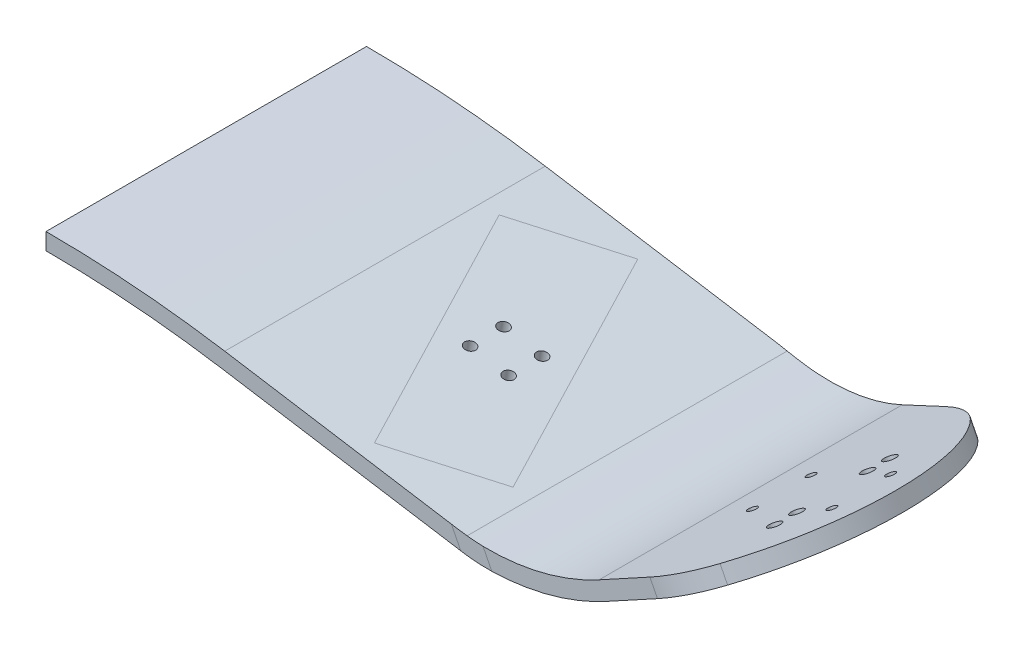
ISO-10303-21;
HEADER;
FILE_DESCRIPTION(('STEP AP214'),'2;1');
FILE_NAME('part.step','',(''),(''),'','','');
FILE_SCHEMA(('AUTOMOTIVE_DESIGN { 1 0 10303 214 1 1 1 1 }'));
ENDSEC;
DATA;
#1=APPLICATION_CONTEXT('core data for automotive mechanical design processes');
#2=APPLICATION_PROTOCOL_DEFINITION('international standard','automotive_design',2000,#1);
#3=PRODUCT_CONTEXT('',#1,'mechanical');
#4=PRODUCT('Part','Part','',(#3));
#5=PRODUCT_RELATED_PRODUCT_CATEGORY('part','',(#4));
#6=PRODUCT_DEFINITION_FORMATION('','',#4);
#7=PRODUCT_DEFINITION_CONTEXT('part definition',#1,'design');
#8=PRODUCT_DEFINITION('design','',#6,#7);
#9=PRODUCT_DEFINITION_SHAPE('','',#8);
#10=(LENGTH_UNIT() NAMED_UNIT(*) SI_UNIT(.MILLI.,.METRE.));
#11=(NAMED_UNIT(*) PLANE_ANGLE_UNIT() SI_UNIT($,.RADIAN.));
#12=(NAMED_UNIT(*) SI_UNIT($,.STERADIAN.) SOLID_ANGLE_UNIT());
#13=UNCERTAINTY_MEASURE_WITH_UNIT(LENGTH_MEASURE(1.E-05),#10,'distance_accuracy_value','');
#14=(GEOMETRIC_REPRESENTATION_CONTEXT(3) GLOBAL_UNCERTAINTY_ASSIGNED_CONTEXT((#13)) GLOBAL_UNIT_ASSIGNED_CONTEXT((#10,
#11,#12)) REPRESENTATION_CONTEXT('',''));
#15=CARTESIAN_POINT('',(0.,0.,0.));
#16=DIRECTION('',(0.,0.,1.));
#17=DIRECTION('',(1.,0.,0.));
#18=AXIS2_PLACEMENT_3D('',#15,#16,#17);
#19=CARTESIAN_POINT('',(500.,70.,115.));
#20=DIRECTION('',(0.453990499739547,-0.891006524188368,0.));
#21=DIRECTION('',(0.891006524188368,0.453990499739547,0.));
#22=AXIS2_PLACEMENT_3D('',#19,#20,#21);
#23=PLANE('',#22);
#24=CARTESIAN_POINT('',(425.570778440515,32.0764174293827,41.1730643960025));
#25=DIRECTION('',(0.453990499739547,-0.891006524188368,0.));
#26=DIRECTION('',(0.891006524188368,0.453990499739547,0.));
#27=AXIS2_PLACEMENT_3D('',#24,#25,#26);
#28=CIRCLE('',#27,65.);
#29=CARTESIAN_POINT('',(463.969896391473,51.6417452635345,89.8321405003692));
#30=VERTEX_POINT('',#29);
#31=CARTESIAN_POINT('',(429.794226452992,34.2283716763565,106.));
#32=VERTEX_POINT('',#31);
#33=EDGE_CURVE('E199',#30,#32,#28,.T.);
#34=ORIENTED_EDGE('',*,*,#33,.T.);
#35=DIRECTION('',(-0.888634193327707,-0.452781736791419,0.0729244079644266));
#36=VECTOR('',#35,1.);
#37=CARTESIAN_POINT('',(499.043419751203,69.5125980187544,100.317170708483));
#38=LINE('',#37,#36);
#39=CARTESIAN_POINT('',(396.134492808404,17.0778807612352,108.762234636819));
#40=VERTEX_POINT('',#39);
#41=EDGE_CURVE('E424',#32,#40,#38,.T.);
#42=ORIENTED_EDGE('',*,*,#41,.T.);
#43=DIRECTION('',(0.,0.,-1.));
#44=VECTOR('',#43,1.);
#45=CARTESIAN_POINT('',(396.134492808404,17.0778807612351,115.));
#46=LINE('',#45,#44);
#47=CARTESIAN_POINT('',(396.134492808404,17.0778807612352,-108.762234636819));
#48=VERTEX_POINT('',#47);
#49=EDGE_CURVE('E218',#40,#48,#46,.T.);
#50=ORIENTED_EDGE('',*,*,#49,.T.);
#51=DIRECTION('',(0.888634193327707,0.452781736791419,0.0729244079644266));
#52=VECTOR('',#51,1.);
#53=CARTESIAN_POINT('',(513.948137913638,77.1069312400568,-99.0940377747818));
#54=LINE('',#53,#52);
#55=CARTESIAN_POINT('',(429.794226452992,34.2283716763565,-106.));
#56=VERTEX_POINT('',#55);
#57=EDGE_CURVE('E414',#48,#56,#54,.T.);
#58=ORIENTED_EDGE('',*,*,#57,.T.);
#59=CARTESIAN_POINT('',(425.570778440515,32.0764174293827,-41.1730643960025));
#60=DIRECTION('',(0.453990499739547,-0.891006524188368,0.));
#61=DIRECTION('',(0.891006524188368,0.453990499739547,0.));
#62=AXIS2_PLACEMENT_3D('',#59,#60,#61);
#63=CIRCLE('',#62,65.);
#64=CARTESIAN_POINT('',(463.969896391473,51.6417452635345,-89.8321405003691));
#65=VERTEX_POINT('',#64);
#66=EDGE_CURVE('E430',#56,#65,#63,.T.);
#67=ORIENTED_EDGE('',*,*,#66,.T.);
#68=CARTESIAN_POINT('',(393.079217097396,15.5211400312543,0.));
#69=DIRECTION('',(0.453990499739547,-0.891006524188368,0.));
#70=DIRECTION('',(0.891006524188368,0.453990499739547,0.));
#71=AXIS2_PLACEMENT_3D('',#68,#69,#70);
#72=CIRCLE('',#71,120.);
#73=EDGE_CURVE('E432',#65,#30,#72,.T.);
#74=ORIENTED_EDGE('',*,*,#73,.T.);
#75=EDGE_LOOP('',(#34,#42,#50,#58,#67,#74));
#76=FACE_BOUND('',#75,.T.);
#77=CARTESIAN_POINT('',(475.434073461169,57.4830352380548,-21.));
#78=DIRECTION('',(0.453990499739547,-0.891006524188368,0.));
#79=DIRECTION('',(0.891006524188368,0.453990499739547,0.));
#80=AXIS2_PLACEMENT_3D('',#77,#78,#79);
#81=CIRCLE('',#80,3.29999999999999);
#82=CARTESIAN_POINT('',(478.37439499099,58.9812038871953,-21.));
#83=VERTEX_POINT('',#82);
#84=EDGE_CURVE('E337',#83,#83,#81,.T.);
#85=ORIENTED_EDGE('',*,*,#84,.F.);
#86=EDGE_LOOP('',(#85));
#87=FACE_BOUND('',#86,.T.);
#88=CARTESIAN_POINT('',(475.434073461169,57.4830352380548,21.));
#89=DIRECTION('',(0.453990499739547,-0.891006524188368,0.));
#90=DIRECTION('',(0.891006524188368,0.453990499739547,0.));
#91=AXIS2_PLACEMENT_3D('',#88,#89,#90);
#92=CIRCLE('',#91,3.29999999999999);
#93=CARTESIAN_POINT('',(478.37439499099,58.9812038871953,21.));
#94=VERTEX_POINT('',#93);
#95=EDGE_CURVE('E808',#94,#94,#92,.T.);
#96=ORIENTED_EDGE('',*,*,#95,.F.);
#97=EDGE_LOOP('',(#96));
#98=FACE_BOUND('',#97,.T.);
#99=CARTESIAN_POINT('',(454.685204532394,46.9109584706199,-41.35));
#100=DIRECTION('',(0.453990499739547,-0.891006524188368,0.));
#101=DIRECTION('',(0.891006524188368,0.453990499739547,0.));
#102=AXIS2_PLACEMENT_3D('',#99,#100,#101);
#103=CIRCLE('',#102,4.49999999999999);
#104=CARTESIAN_POINT('',(458.694733891242,48.9539157194479,-41.35));
#105=VERTEX_POINT('',#104);
#106=EDGE_CURVE('E801',#105,#105,#103,.T.);
#107=ORIENTED_EDGE('',*,*,#106,.F.);
#108=EDGE_LOOP('',(#107));
#109=FACE_BOUND('',#108,.T.);
#110=CARTESIAN_POINT('',(454.685204532394,46.9109584706199,41.35));
#111=DIRECTION('',(0.453990499739547,-0.891006524188368,0.));
#112=DIRECTION('',(0.891006524188368,0.453990499739547,0.));
#113=AXIS2_PLACEMENT_3D('',#110,#111,#112);
#114=CIRCLE('',#113,4.49999999999999);
#115=CARTESIAN_POINT('',(458.694733891242,48.9539157194479,41.35));
#116=VERTEX_POINT('',#115);
#117=EDGE_CURVE('E786',#116,#116,#114,.T.);
#118=ORIENTED_EDGE('',*,*,#117,.F.);
#119=EDGE_LOOP('',(#118));
#120=FACE_BOUND('',#119,.T.);
#121=CARTESIAN_POINT('',(440.684819017822,39.7774057482125,0.));
#122=DIRECTION('',(0.453990499739547,-0.891006524188368,0.));
#123=DIRECTION('',(0.891006524188368,0.453990499739547,0.));
#124=AXIS2_PLACEMENT_3D('',#121,#122,#123);
#125=CIRCLE('',#124,37.5);
#126=CARTESIAN_POINT('',(474.097563674886,56.8020494884455,0.));
#127=VERTEX_POINT('',#126);
#128=EDGE_CURVE('E11',#127,#127,#125,.F.);
#129=ORIENTED_EDGE('',*,*,#128,.T.);
#130=EDGE_LOOP('',(#129));
#131=FACE_BOUND('',#130,.T.);
#132=ADVANCED_FACE('F41',(#76,#87,#98,#109,#120,#131),#23,.T.);
#133=CARTESIAN_POINT('',(302.042599511785,13.8329261866839,115.));
#134=DIRECTION('',(-0.158669205585093,-0.987331799953286,0.));
#135=DIRECTION('',(0.987331799953286,-0.158669205585093,0.));
#136=AXIS2_PLACEMENT_3D('',#133,#134,#135);
#137=PLANE('',#136);
#138=DIRECTION('',(0.,0.,-1.));
#139=VECTOR('',#138,1.);
#140=CARTESIAN_POINT('',(302.042599511785,13.8329261866839,115.));
#141=LINE('',#140,#139);
#142=CARTESIAN_POINT('',(302.042599511785,13.8329261866839,114.833314530342));
#143=VERTEX_POINT('',#142);
#144=CARTESIAN_POINT('',(302.042599511785,13.8329261866839,-114.833314530342));
#145=VERTEX_POINT('',#144);
#146=EDGE_CURVE('E212',#143,#145,#141,.T.);
#147=ORIENTED_EDGE('',*,*,#146,.T.);
#148=CARTESIAN_POINT('',(290.884693319234,15.6260580514214,135.));
#149=DIRECTION('',(-0.158669205585093,-0.987331799953286,0.));
#150=DIRECTION('',(0.987331799953286,-0.158669205585093,0.));
#151=AXIS2_PLACEMENT_3D('',#148,#149,#150);
#152=ELLIPSE('',#151,309.526700689435,250.);
#153=CARTESIAN_POINT('',(290.884693319234,15.6260580514215,-115.));
#154=VERTEX_POINT('',#153);
#155=EDGE_CURVE('E493',#145,#154,#152,.F.);
#156=ORIENTED_EDGE('',*,*,#155,.T.);
#157=DIRECTION('',(-0.987331799953286,0.158669205585093,0.));
#158=VECTOR('',#157,1.);
#159=CARTESIAN_POINT('',(302.042599511785,13.8329261866839,-115.));
#160=LINE('',#159,#158);
#161=CARTESIAN_POINT('',(128.272202720007,41.7587063696602,-115.));
#162=VERTEX_POINT('',#161);
#163=EDGE_CURVE('E196',#154,#162,#160,.T.);
#164=ORIENTED_EDGE('',*,*,#163,.T.);
#165=DIRECTION('',(0.,0.,-1.));
#166=VECTOR('',#165,1.);
#167=CARTESIAN_POINT('',(128.272202720007,41.7587063696602,115.));
#168=LINE('',#167,#166);
#169=CARTESIAN_POINT('',(128.272202720007,41.7587063696602,115.));
#170=VERTEX_POINT('',#169);
#171=EDGE_CURVE('E204',#170,#162,#168,.T.);
#172=ORIENTED_EDGE('',*,*,#171,.F.);
#173=DIRECTION('',(-0.987331799953286,0.158669205585093,0.));
#174=VECTOR('',#173,1.);
#175=CARTESIAN_POINT('',(302.042599511785,13.8329261866839,115.));
#176=LINE('',#175,#174);
#177=CARTESIAN_POINT('',(290.884693319234,15.6260580514215,115.));
#178=VERTEX_POINT('',#177);
#179=EDGE_CURVE('E193',#178,#170,#176,.T.);
#180=ORIENTED_EDGE('',*,*,#179,.F.);
#181=CARTESIAN_POINT('',(290.884693319234,15.6260580514214,-135.));
#182=DIRECTION('',(-0.158669205585093,-0.987331799953286,0.));
#183=DIRECTION('',(-0.987331799953286,0.158669205585093,0.));
#184=AXIS2_PLACEMENT_3D('',#181,#182,#183);
#185=ELLIPSE('',#184,309.526700689435,250.);
#186=EDGE_CURVE('E282',#178,#143,#185,.F.);
#187=ORIENTED_EDGE('',*,*,#186,.T.);
#188=EDGE_LOOP('',(#147,#156,#164,#172,#180,#187));
#189=FACE_BOUND('',#188,.T.);
#190=DIRECTION('',(0.886961307594917,-0.142539160662565,-0.439297423742874));
#191=VECTOR('',#190,1.);
#192=CARTESIAN_POINT('',(282.242889237076,17.0148396024693,73.9910543309096));
#193=LINE('',#192,#191);
#194=CARTESIAN_POINT('',(223.672519842727,26.4273937033973,103.));
#195=VERTEX_POINT('',#194);
#196=CARTESIAN_POINT('',(290.194617912345,15.736956653705,70.0526932192845));
#197=VERTEX_POINT('',#196);
#198=EDGE_CURVE('E51',#195,#197,#193,.T.);
#199=ORIENTED_EDGE('',*,*,#198,.F.);
#200=DIRECTION('',(0.433732316098893,-0.0697029732408597,0.898341679703705));
#201=VECTOR('',#200,1.);
#202=CARTESIAN_POINT('',(243.472230117435,23.2454802876119,144.00894566909));
#203=LINE('',#202,#201);
#204=CARTESIAN_POINT('',(140.120184319446,39.8546759026391,-70.0526932192845));
#205=VERTEX_POINT('',#204);
#206=EDGE_CURVE('E350',#205,#195,#203,.T.);
#207=ORIENTED_EDGE('',*,*,#206,.F.);
#208=DIRECTION('',(-0.886961307594917,0.142539160662565,0.439297423742874));
#209=VECTOR('',#208,1.);
#210=CARTESIAN_POINT('',(198.690553713796,30.4421218017111,-99.0616388883749));
#211=LINE('',#210,#209);
#212=CARTESIAN_POINT('',(206.642282389065,29.1642388529467,-103.));
#213=VERTEX_POINT('',#212);
#214=EDGE_CURVE('E353',#213,#205,#211,.T.);
#215=ORIENTED_EDGE('',*,*,#214,.F.);
#216=DIRECTION('',(-0.433732316098893,0.0697029732408597,-0.898341679703705));
#217=VECTOR('',#216,1.);
#218=CARTESIAN_POINT('',(309.994328187054,12.5550432379195,111.061638888375));
#219=LINE('',#218,#217);
#220=EDGE_CURVE('E61',#197,#213,#219,.T.);
#221=ORIENTED_EDGE('',*,*,#220,.F.);
#222=EDGE_LOOP('',(#199,#207,#215,#221));
#223=FACE_BOUND('',#222,.T.);
#224=ADVANCED_FACE('F303',(#189,#223),#137,.F.);
#225=CARTESIAN_POINT('',(-325.,156.687183650789,115.));
#226=DIRECTION('',(0.,0.,-1.));
#227=DIRECTION('',(-1.,0.,0.));
#228=AXIS2_PLACEMENT_3D('',#225,#226,#227);
#229=PLANE('',#228);
#230=DIRECTION('',(0.,-1.,0.));
#231=VECTOR('',#230,1.);
#232=CARTESIAN_POINT('',(0.,80.6920782902604,115.));
#233=LINE('',#232,#231);
#234=CARTESIAN_POINT('',(0.,52.,115.));
#235=VERTEX_POINT('',#234);
#236=CARTESIAN_POINT('',(0.,40.,115.));
#237=VERTEX_POINT('',#236);
#238=EDGE_CURVE('E167',#235,#237,#233,.T.);
#239=ORIENTED_EDGE('',*,*,#238,.T.);
#240=CARTESIAN_POINT('',(0.,-756.42531634921,115.));
#241=DIRECTION('',(0.,0.,1.));
#242=DIRECTION('',(-1.,0.,0.));
#243=AXIS2_PLACEMENT_3D('',#240,#241,#242);
#244=CIRCLE('',#243,796.42531634921);
#245=CARTESIAN_POINT('',(126.368172252985,29.9107247702207,115.));
#246=VERTEX_POINT('',#245);
#247=EDGE_CURVE('E182',#246,#237,#244,.T.);
#248=ORIENTED_EDGE('',*,*,#247,.F.);
#249=DIRECTION('',(-0.987331799953286,0.158669205585093,0.));
#250=VECTOR('',#249,1.);
#251=CARTESIAN_POINT('',(300.138569044764,1.98494458724443,115.));
#252=LINE('',#251,#250);
#253=CARTESIAN_POINT('',(297.629758032613,2.38812318463176,115.));
#254=VERTEX_POINT('',#253);
#255=EDGE_CURVE('E190',#254,#246,#252,.T.);
#256=ORIENTED_EDGE('',*,*,#255,.F.);
#257=DIRECTION('',(0.453990499739547,-0.891006524188368,0.));
#258=VECTOR('',#257,1.);
#259=CARTESIAN_POINT('',(293.909757138151,9.68903602059101,115.));
#260=LINE('',#259,#258);
#261=EDGE_CURVE('E343',#254,#178,#260,.F.);
#262=ORIENTED_EDGE('',*,*,#261,.T.);
#263=ORIENTED_EDGE('',*,*,#179,.T.);
#264=CARTESIAN_POINT('',(0.,-756.42531634921,115.));
#265=DIRECTION('',(0.,0.,1.));
#266=DIRECTION('',(1.,0.,0.));
#267=AXIS2_PLACEMENT_3D('',#264,#265,#266);
#268=CIRCLE('',#267,808.42531634921);
#269=EDGE_CURVE('E184',#170,#235,#268,.T.);
#270=ORIENTED_EDGE('',*,*,#269,.T.);
#271=EDGE_LOOP('',(#239,#248,#256,#262,#263,#270));
#272=FACE_BOUND('',#271,.T.);
#273=ADVANCED_FACE('F180',(#272),#229,.F.);
#274=CARTESIAN_POINT('',(-325.,156.687183650789,-115.));
#275=DIRECTION('',(0.,0.,-1.));
#276=DIRECTION('',(-1.,0.,0.));
#277=AXIS2_PLACEMENT_3D('',#274,#275,#276);
#278=PLANE('',#277);
#279=CARTESIAN_POINT('',(0.,-756.42531634921,-115.));
#280=DIRECTION('',(0.,0.,1.));
#281=DIRECTION('',(-1.,0.,0.));
#282=AXIS2_PLACEMENT_3D('',#279,#280,#281);
#283=CIRCLE('',#282,796.42531634921);
#284=CARTESIAN_POINT('',(126.368172252985,29.9107247702207,-115.));
#285=VERTEX_POINT('',#284);
#286=CARTESIAN_POINT('',(0.,40.,-115.));
#287=VERTEX_POINT('',#286);
#288=EDGE_CURVE('E205',#285,#287,#283,.T.);
#289=ORIENTED_EDGE('',*,*,#288,.T.);
#290=DIRECTION('',(0.,-1.,0.));
#291=VECTOR('',#290,1.);
#292=CARTESIAN_POINT('',(0.,80.6920782902604,-115.));
#293=LINE('',#292,#291);
#294=CARTESIAN_POINT('',(0.,52.,-115.));
#295=VERTEX_POINT('',#294);
#296=EDGE_CURVE('E170',#295,#287,#293,.T.);
#297=ORIENTED_EDGE('',*,*,#296,.F.);
#298=CARTESIAN_POINT('',(0.,-756.42531634921,-115.));
#299=DIRECTION('',(0.,0.,1.));
#300=DIRECTION('',(1.,0.,0.));
#301=AXIS2_PLACEMENT_3D('',#298,#299,#300);
#302=CIRCLE('',#301,808.42531634921);
#303=EDGE_CURVE('E191',#162,#295,#302,.T.);
#304=ORIENTED_EDGE('',*,*,#303,.F.);
#305=ORIENTED_EDGE('',*,*,#163,.F.);
#306=DIRECTION('',(0.453990499739547,-0.891006524188368,0.));
#307=VECTOR('',#306,1.);
#308=CARTESIAN_POINT('',(106.885892654702,376.744037235979,-115.));
#309=LINE('',#308,#307);
#310=CARTESIAN_POINT('',(297.629758032613,2.38812318463175,-115.));
#311=VERTEX_POINT('',#310);
#312=EDGE_CURVE('E231',#154,#311,#309,.T.);
#313=ORIENTED_EDGE('',*,*,#312,.T.);
#314=DIRECTION('',(-0.987331799953286,0.158669205585093,0.));
#315=VECTOR('',#314,1.);
#316=CARTESIAN_POINT('',(300.138569044764,1.98494458724443,-115.));
#317=LINE('',#316,#315);
#318=EDGE_CURVE('E207',#311,#285,#317,.T.);
#319=ORIENTED_EDGE('',*,*,#318,.T.);
#320=EDGE_LOOP('',(#289,#297,#304,#305,#313,#319));
#321=FACE_BOUND('',#320,.T.);
#322=ADVANCED_FACE('F267',(#321),#278,.T.);
#323=CARTESIAN_POINT('',(0.,-756.42531634921,115.));
#324=DIRECTION('',(0.,0.,-1.));
#325=DIRECTION('',(-1.,0.,0.));
#326=AXIS2_PLACEMENT_3D('',#323,#324,#325);
#327=CYLINDRICAL_SURFACE('',#326,796.42531634921);
#328=ORIENTED_EDGE('',*,*,#247,.T.);
#329=DIRECTION('',(0.,0.,-1.));
#330=VECTOR('',#329,1.);
#331=CARTESIAN_POINT('',(0.,40.,115.));
#332=LINE('',#331,#330);
#333=EDGE_CURVE('E164',#237,#287,#332,.T.);
#334=ORIENTED_EDGE('',*,*,#333,.T.);
#335=ORIENTED_EDGE('',*,*,#288,.F.);
#336=DIRECTION('',(0.,0.,-1.));
#337=VECTOR('',#336,1.);
#338=CARTESIAN_POINT('',(126.368172252985,29.9107247702207,115.));
#339=LINE('',#338,#337);
#340=EDGE_CURVE('E189',#246,#285,#339,.T.);
#341=ORIENTED_EDGE('',*,*,#340,.F.);
#342=EDGE_LOOP('',(#328,#334,#335,#341));
#343=FACE_BOUND('',#342,.T.);
#344=ADVANCED_FACE('F187',(#343),#327,.F.);
#345=CARTESIAN_POINT('',(0.,-756.42531634921,115.));
#346=DIRECTION('',(0.,0.,-1.));
#347=DIRECTION('',(-1.,0.,0.));
#348=AXIS2_PLACEMENT_3D('',#345,#346,#347);
#349=CYLINDRICAL_SURFACE('',#348,808.42531634921);
#350=DIRECTION('',(0.,0.,-1.));
#351=VECTOR('',#350,1.);
#352=CARTESIAN_POINT('',(0.,52.,115.));
#353=LINE('',#352,#351);
#354=EDGE_CURVE('E348',#235,#295,#353,.T.);
#355=ORIENTED_EDGE('',*,*,#354,.F.);
#356=ORIENTED_EDGE('',*,*,#269,.F.);
#357=ORIENTED_EDGE('',*,*,#171,.T.);
#358=ORIENTED_EDGE('',*,*,#303,.T.);
#359=EDGE_LOOP('',(#355,#356,#357,#358));
#360=FACE_BOUND('',#359,.T.);
#361=ADVANCED_FACE('F266',(#360),#349,.T.);
#362=CARTESIAN_POINT('',(494.552114003125,80.6920782902604,115.));
#363=DIRECTION('',(0.453990499739547,-0.891006524188368,0.));
#364=DIRECTION('',(0.891006524188368,0.453990499739547,0.));
#365=AXIS2_PLACEMENT_3D('',#362,#363,#364);
#366=PLANE('',#365);
#367=CARTESIAN_POINT('',(449.237318535519,57.6030367608804,25.35));
#368=DIRECTION('',(-0.453990499739547,0.891006524188368,0.));
#369=DIRECTION('',(-0.891006524188368,-0.453990499739547,0.));
#370=AXIS2_PLACEMENT_3D('',#367,#368,#369);
#371=CIRCLE('',#370,4.49999999999999);
#372=CARTESIAN_POINT('',(445.227789176672,55.5600795120524,25.35));
#373=VERTEX_POINT('',#372);
#374=EDGE_CURVE('E791',#373,#373,#371,.T.);
#375=ORIENTED_EDGE('',*,*,#374,.F.);
#376=EDGE_LOOP('',(#375));
#377=FACE_BOUND('',#376,.T.);
#378=CARTESIAN_POINT('',(449.237318535519,57.6030367608804,-25.35));
#379=DIRECTION('',(-0.453990499739547,0.891006524188368,0.));
#380=DIRECTION('',(-0.891006524188368,-0.453990499739547,0.));
#381=AXIS2_PLACEMENT_3D('',#378,#379,#380);
#382=CIRCLE('',#381,4.49999999999999);
#383=CARTESIAN_POINT('',(445.227789176672,55.5600795120524,-25.35));
#384=VERTEX_POINT('',#383);
#385=EDGE_CURVE('E347',#384,#384,#382,.T.);
#386=ORIENTED_EDGE('',*,*,#385,.F.);
#387=EDGE_LOOP('',(#386));
#388=FACE_BOUND('',#387,.T.);
#389=CARTESIAN_POINT('',(412.961769916238,39.1197215449842,21.));
#390=DIRECTION('',(-0.453990499739547,0.891006524188368,0.));
#391=DIRECTION('',(-0.891006524188368,-0.453990499739547,0.));
#392=AXIS2_PLACEMENT_3D('',#389,#390,#391);
#393=CIRCLE('',#392,3.29999999999999);
#394=CARTESIAN_POINT('',(410.021448386417,37.6215528958437,21.));
#395=VERTEX_POINT('',#394);
#396=EDGE_CURVE('E811',#395,#395,#393,.T.);
#397=ORIENTED_EDGE('',*,*,#396,.F.);
#398=EDGE_LOOP('',(#397));
#399=FACE_BOUND('',#398,.T.);
#400=CARTESIAN_POINT('',(469.986187464294,68.1751135283152,-21.));
#401=DIRECTION('',(-0.453990499739547,0.891006524188368,0.));
#402=DIRECTION('',(-0.891006524188368,-0.453990499739547,0.));
#403=AXIS2_PLACEMENT_3D('',#400,#401,#402);
#404=CIRCLE('',#403,3.29999999999999);
#405=CARTESIAN_POINT('',(467.045865934472,66.6769448791747,-21.));
#406=VERTEX_POINT('',#405);
#407=EDGE_CURVE('E333',#406,#406,#404,.T.);
#408=ORIENTED_EDGE('',*,*,#407,.F.);
#409=EDGE_LOOP('',(#408));
#410=FACE_BOUND('',#409,.T.);
#411=DIRECTION('',(-0.888634193327707,-0.452781736791419,0.0729244079644266));
#412=VECTOR('',#411,1.);
#413=CARTESIAN_POINT('',(493.595533754329,80.2046763090148,100.317170708483));
#414=LINE('',#413,#412);
#415=CARTESIAN_POINT('',(424.346340456117,44.9204499666169,106.));
#416=VERTEX_POINT('',#415);
#417=CARTESIAN_POINT('',(390.686606811529,27.7699590514955,108.762234636819));
#418=VERTEX_POINT('',#417);
#419=EDGE_CURVE('E422',#416,#418,#414,.T.);
#420=ORIENTED_EDGE('',*,*,#419,.F.);
#421=CARTESIAN_POINT('',(420.12289244364,42.7684957196431,41.1730643960025));
#422=DIRECTION('',(0.453990499739547,-0.891006524188368,0.));
#423=DIRECTION('',(0.891006524188368,0.453990499739547,0.));
#424=AXIS2_PLACEMENT_3D('',#421,#422,#423);
#425=CIRCLE('',#424,65.);
#426=CARTESIAN_POINT('',(458.522010394599,62.3338235537949,89.8321405003692));
#427=VERTEX_POINT('',#426);
#428=EDGE_CURVE('E229',#427,#416,#425,.T.);
#429=ORIENTED_EDGE('',*,*,#428,.F.);
#430=CARTESIAN_POINT('',(387.631331100521,26.2132183215147,0.));
#431=DIRECTION('',(0.453990499739547,-0.891006524188368,0.));
#432=DIRECTION('',(0.891006524188368,0.453990499739547,0.));
#433=AXIS2_PLACEMENT_3D('',#430,#431,#432);
#434=CIRCLE('',#433,120.);
#435=CARTESIAN_POINT('',(458.522010394599,62.3338235537949,-89.8321405003691));
#436=VERTEX_POINT('',#435);
#437=EDGE_CURVE('E227',#436,#427,#434,.T.);
#438=ORIENTED_EDGE('',*,*,#437,.F.);
#439=CARTESIAN_POINT('',(420.12289244364,42.7684957196431,-41.1730643960025));
#440=DIRECTION('',(0.453990499739547,-0.891006524188368,0.));
#441=DIRECTION('',(0.891006524188368,0.453990499739547,0.));
#442=AXIS2_PLACEMENT_3D('',#439,#440,#441);
#443=CIRCLE('',#442,65.);
#444=CARTESIAN_POINT('',(424.346340456117,44.920449966617,-106.));
#445=VERTEX_POINT('',#444);
#446=EDGE_CURVE('E225',#445,#436,#443,.T.);
#447=ORIENTED_EDGE('',*,*,#446,.F.);
#448=DIRECTION('',(0.888634193327707,0.452781736791419,0.0729244079644266));
#449=VECTOR('',#448,1.);
#450=CARTESIAN_POINT('',(508.500251916764,87.7990095303172,-99.0940377747818));
#451=LINE('',#450,#449);
#452=CARTESIAN_POINT('',(390.686606811529,27.7699590514955,-108.762234636819));
#453=VERTEX_POINT('',#452);
#454=EDGE_CURVE('E412',#453,#445,#451,.T.);
#455=ORIENTED_EDGE('',*,*,#454,.F.);
#456=DIRECTION('',(0.,0.,-1.));
#457=VECTOR('',#456,1.);
#458=CARTESIAN_POINT('',(390.686606811529,27.7699590514955,115.));
#459=LINE('',#458,#457);
#460=EDGE_CURVE('E215',#418,#453,#459,.T.);
#461=ORIENTED_EDGE('',*,*,#460,.F.);
#462=EDGE_LOOP('',(#420,#429,#438,#447,#455,#461));
#463=FACE_BOUND('',#462,.T.);
#464=CARTESIAN_POINT('',(412.961769916238,39.1197215449842,-21.));
#465=DIRECTION('',(-0.453990499739547,0.891006524188368,0.));
#466=DIRECTION('',(-0.891006524188368,-0.453990499739547,0.));
#467=AXIS2_PLACEMENT_3D('',#464,#465,#466);
#468=CIRCLE('',#467,3.29999999999999);
#469=CARTESIAN_POINT('',(410.021448386417,37.6215528958437,-21.));
#470=VERTEX_POINT('',#469);
#471=EDGE_CURVE('E334',#470,#470,#468,.T.);
#472=ORIENTED_EDGE('',*,*,#471,.F.);
#473=EDGE_LOOP('',(#472));
#474=FACE_BOUND('',#473,.T.);
#475=CARTESIAN_POINT('',(469.986187464294,68.1751135283152,21.));
#476=DIRECTION('',(-0.453990499739547,0.891006524188368,0.));
#477=DIRECTION('',(-0.891006524188368,-0.453990499739547,0.));
#478=AXIS2_PLACEMENT_3D('',#475,#476,#477);
#479=CIRCLE('',#478,3.29999999999999);
#480=CARTESIAN_POINT('',(467.045865934472,66.6769448791747,21.));
#481=VERTEX_POINT('',#480);
#482=EDGE_CURVE('E346',#481,#481,#479,.T.);
#483=ORIENTED_EDGE('',*,*,#482,.F.);
#484=EDGE_LOOP('',(#483));
#485=FACE_BOUND('',#484,.T.);
#486=CARTESIAN_POINT('',(449.237318535519,57.6030367608804,-41.35));
#487=DIRECTION('',(-0.453990499739547,0.891006524188368,0.));
#488=DIRECTION('',(-0.891006524188368,-0.453990499739547,0.));
#489=AXIS2_PLACEMENT_3D('',#486,#487,#488);
#490=CIRCLE('',#489,4.49999999999999);
#491=CARTESIAN_POINT('',(445.227789176672,55.5600795120524,-41.35));
#492=VERTEX_POINT('',#491);
#493=EDGE_CURVE('E798',#492,#492,#490,.T.);
#494=ORIENTED_EDGE('',*,*,#493,.F.);
#495=EDGE_LOOP('',(#494));
#496=FACE_BOUND('',#495,.T.);
#497=CARTESIAN_POINT('',(449.237318535519,57.6030367608804,41.35));
#498=DIRECTION('',(-0.453990499739547,0.891006524188368,0.));
#499=DIRECTION('',(-0.891006524188368,-0.453990499739547,0.));
#500=AXIS2_PLACEMENT_3D('',#497,#498,#499);
#501=CIRCLE('',#500,4.49999999999999);
#502=CARTESIAN_POINT('',(445.227789176672,55.5600795120524,41.35));
#503=VERTEX_POINT('',#502);
#504=EDGE_CURVE('E175',#503,#503,#501,.T.);
#505=ORIENTED_EDGE('',*,*,#504,.F.);
#506=EDGE_LOOP('',(#505));
#507=FACE_BOUND('',#506,.T.);
#508=ADVANCED_FACE('F255',(#377,#388,#399,#410,#463,#474,#485,#496,#507),#366,.F.);
#509=CARTESIAN_POINT('',(325.,156.687183650789,115.));
#510=DIRECTION('',(0.,0.,-1.));
#511=DIRECTION('',(-1.,0.,0.));
#512=AXIS2_PLACEMENT_3D('',#509,#510,#511);
#513=CYLINDRICAL_SURFACE('',#512,156.687183650789);
#514=DIRECTION('',(0.,0.,-1.));
#515=VECTOR('',#514,1.);
#516=CARTESIAN_POINT('',(300.138569044764,1.98494458724443,115.));
#517=LINE('',#516,#515);
#518=CARTESIAN_POINT('',(300.138569044764,1.98494458724443,114.991575759867));
#519=VERTEX_POINT('',#518);
#520=CARTESIAN_POINT('',(300.138569044764,1.98494458724443,-114.991575759867));
#521=VERTEX_POINT('',#520);
#522=EDGE_CURVE('E221',#519,#521,#517,.T.);
#523=ORIENTED_EDGE('',*,*,#522,.T.);
#524=CARTESIAN_POINT('',(300.138569044764,1.98494458724443,-114.991575759867));
#525=CARTESIAN_POINT('',(301.721920183928,1.7304776371723,-114.980950775236));
#526=CARTESIAN_POINT('',(303.309131896198,1.50035509375725,-114.9601226857));
#527=CARTESIAN_POINT('',(306.487624349743,1.08921000671147,-114.896814215632));
#528=CARTESIAN_POINT('',(308.078898369546,0.90813166160906,-114.854358602309));
#529=CARTESIAN_POINT('',(311.26549810961,0.594903109330025,-114.746530275888));
#530=CARTESIAN_POINT('',(312.860823850455,0.462753151222783,-114.681157446134));
#531=CARTESIAN_POINT('',(316.055432884978,0.247305573302988,-114.526221606121));
#532=CARTESIAN_POINT('',(317.654718618209,0.164064009008773,-114.436631010056));
#533=CARTESIAN_POINT('',(319.254113117971,0.105389356704476,-114.334367707683));
#534=B_SPLINE_CURVE_WITH_KNOTS('',3,(#524,#525,#526,#527,#528,#529,#530,#531,#532,#533),
.UNSPECIFIED.,.F.,.F.,(4,2,2,2,4),(0.,4.81091489677629,9.61633281793514,14.421775200681,
19.2327145689912),.UNSPECIFIED.);
#535=CARTESIAN_POINT('',(319.254113117971,0.105389356704511,-114.334367707683));
#536=VERTEX_POINT('',#535);
#537=EDGE_CURVE('E244',#521,#536,#534,.T.);
#538=ORIENTED_EDGE('',*,*,#537,.T.);
#539=CARTESIAN_POINT('',(325.,156.687183650789,-108.762234636819));
#540=DIRECTION('',(0.0649761232688783,0.0331069884149807,-0.99733747083073));
#541=DIRECTION('',(-0.888634193327706,-0.452781736791419,-0.0729244079644266));
#542=AXIS2_PLACEMENT_3D('',#539,#540,#541);
#543=ELLIPSE('',#542,157.105481578143,156.687183650789);
#544=EDGE_CURVE('E417',#536,#48,#543,.F.);
#545=ORIENTED_EDGE('',*,*,#544,.T.);
#546=ORIENTED_EDGE('',*,*,#49,.F.);
#547=CARTESIAN_POINT('',(325.,156.687183650789,108.762234636819));
#548=DIRECTION('',(0.0649761232688783,0.0331069884149807,0.99733747083073));
#549=DIRECTION('',(0.888634193327706,0.452781736791419,-0.0729244079644266));
#550=AXIS2_PLACEMENT_3D('',#547,#548,#549);
#551=ELLIPSE('',#550,157.105481578143,156.687183650789);
#552=CARTESIAN_POINT('',(319.254113117971,0.105389356704511,114.334367707683));
#553=VERTEX_POINT('',#552);
#554=EDGE_CURVE('E427',#40,#553,#551,.F.);
#555=ORIENTED_EDGE('',*,*,#554,.T.);
#556=CARTESIAN_POINT('',(319.254113117971,0.105389356704542,114.334367707683));
#557=CARTESIAN_POINT('',(317.654718618209,0.164064009008815,114.436631010056));
#558=CARTESIAN_POINT('',(316.055432884978,0.247305573303024,114.526221606121));
#559=CARTESIAN_POINT('',(312.860823850455,0.462753151222812,114.681157446134));
#560=CARTESIAN_POINT('',(311.26549810961,0.594903109330051,114.746530275888));
#561=CARTESIAN_POINT('',(308.078898369546,0.908131661609064,114.854358602309));
#562=CARTESIAN_POINT('',(306.487624349743,1.08921000671146,114.896814215632));
#563=CARTESIAN_POINT('',(303.309131896198,1.50035509375723,114.9601226857));
#564=CARTESIAN_POINT('',(301.721920183928,1.73047763717228,114.980950775236));
#565=CARTESIAN_POINT('',(300.138569044764,1.98494458724445,114.991575759867));
#566=B_SPLINE_CURVE_WITH_KNOTS('',3,(#556,#557,#558,#559,#560,#561,#562,#563,#564,#565),
.UNSPECIFIED.,.F.,.F.,(4,2,2,2,4),(0.,4.81093936831023,9.61638175105598,14.4217996722148,
19.2327145689911),.UNSPECIFIED.);
#567=EDGE_CURVE('E238',#553,#519,#566,.T.);
#568=ORIENTED_EDGE('',*,*,#567,.T.);
#569=EDGE_LOOP('',(#523,#538,#545,#546,#555,#568));
#570=FACE_BOUND('',#569,.T.);
#571=ADVANCED_FACE('F249',(#570),#513,.T.);
#572=ORIENTED_EDGE('',*,*,#128,.F.);
#573=EDGE_LOOP('',(#572));
#574=FACE_BOUND('',#573,.T.);
#575=CARTESIAN_POINT('',(454.685204532394,46.9109584706199,25.35));
#576=DIRECTION('',(0.453990499739547,-0.891006524188368,0.));
#577=DIRECTION('',(0.891006524188368,0.453990499739547,0.));
#578=AXIS2_PLACEMENT_3D('',#575,#576,#577);
#579=CIRCLE('',#578,4.49999999999999);
#580=CARTESIAN_POINT('',(458.694733891242,48.9539157194479,25.35));
#581=VERTEX_POINT('',#580);
#582=EDGE_CURVE('E320',#581,#581,#579,.T.);
#583=ORIENTED_EDGE('',*,*,#582,.F.);
#584=EDGE_LOOP('',(#583));
#585=FACE_BOUND('',#584,.T.);
#586=CARTESIAN_POINT('',(454.685204532394,46.9109584706199,-25.35));
#587=DIRECTION('',(0.453990499739547,-0.891006524188368,0.));
#588=DIRECTION('',(0.891006524188368,0.453990499739547,0.));
#589=AXIS2_PLACEMENT_3D('',#586,#587,#588);
#590=CIRCLE('',#589,4.49999999999999);
#591=CARTESIAN_POINT('',(458.694733891242,48.9539157194479,-25.35));
#592=VERTEX_POINT('',#591);
#593=EDGE_CURVE('E324',#592,#592,#590,.T.);
#594=ORIENTED_EDGE('',*,*,#593,.F.);
#595=EDGE_LOOP('',(#594));
#596=FACE_BOUND('',#595,.T.);
#597=CARTESIAN_POINT('',(418.409655913113,28.4276432547238,21.));
#598=DIRECTION('',(0.453990499739547,-0.891006524188368,0.));
#599=DIRECTION('',(0.891006524188368,0.453990499739547,0.));
#600=AXIS2_PLACEMENT_3D('',#597,#598,#599);
#601=CIRCLE('',#600,3.29999999999999);
#602=CARTESIAN_POINT('',(421.349977442935,29.9258119038643,21.));
#603=VERTEX_POINT('',#602);
#604=EDGE_CURVE('E328',#603,#603,#601,.T.);
#605=ORIENTED_EDGE('',*,*,#604,.F.);
#606=EDGE_LOOP('',(#605));
#607=FACE_BOUND('',#606,.T.);
#608=CARTESIAN_POINT('',(418.409655913113,28.4276432547238,-21.));
#609=DIRECTION('',(0.453990499739547,-0.891006524188368,0.));
#610=DIRECTION('',(0.891006524188368,0.453990499739547,0.));
#611=AXIS2_PLACEMENT_3D('',#608,#609,#610);
#612=CIRCLE('',#611,3.29999999999999);
#613=CARTESIAN_POINT('',(421.349977442935,29.9258119038643,-21.));
#614=VERTEX_POINT('',#613);
#615=EDGE_CURVE('E331',#614,#614,#612,.T.);
#616=ORIENTED_EDGE('',*,*,#615,.F.);
#617=EDGE_LOOP('',(#616));
#618=FACE_BOUND('',#617,.T.);
#619=ADVANCED_FACE('F254',(#574,#585,#596,#607,#618),#23,.T.);
#620=CARTESIAN_POINT('',(325.,156.687183650789,115.));
#621=DIRECTION('',(0.,0.,-1.));
#622=DIRECTION('',(-1.,0.,0.));
#623=AXIS2_PLACEMENT_3D('',#620,#621,#622);
#624=CYLINDRICAL_SURFACE('',#623,144.687183650789);
#625=CARTESIAN_POINT('',(325.,156.687183650789,-108.762234636819));
#626=DIRECTION('',(0.0649761232688783,0.0331069884149807,-0.99733747083073));
#627=DIRECTION('',(-0.888634193327706,-0.452781736791419,-0.0729244079644266));
#628=AXIS2_PLACEMENT_3D('',#625,#626,#627);
#629=ELLIPSE('',#628,145.07344593227,144.687183650789);
#630=CARTESIAN_POINT('',(312.93683020173,12.5037551743679,-114.334367707683));
#631=VERTEX_POINT('',#630);
#632=EDGE_CURVE('E410',#631,#453,#629,.F.);
#633=ORIENTED_EDGE('',*,*,#632,.F.);
#634=CARTESIAN_POINT('',(312.93683020173,12.503755174368,-114.334367707683));
#635=CARTESIAN_POINT('',(312.025791998189,12.5799755522734,-114.391192548491));
#636=CARTESIAN_POINT('',(311.115232348242,12.6648551262795,-114.444043529063));
#637=CARTESIAN_POINT('',(309.295862816479,12.8518717310746,-114.542021261818));
#638=CARTESIAN_POINT('',(308.387052355269,12.954001408347,-114.587151288922));
#639=CARTESIAN_POINT('',(306.571199293229,13.1755220340967,-114.669958474796));
#640=CARTESIAN_POINT('',(305.664156690648,13.2949129654739,-114.70763564095));
#641=CARTESIAN_POINT('',(303.851848561183,13.5509729931741,-114.775806808275));
#642=CARTESIAN_POINT('',(302.946583954406,13.6876494179966,-114.806297746921));
#643=CARTESIAN_POINT('',(302.042599511785,13.8329261866839,-114.833314530342));
#644=B_SPLINE_CURVE_WITH_KNOTS('',3,(#634,#635,#636,#637,#638,#639,#640,#641,#642,#643),
.UNSPECIFIED.,.F.,.F.,(4,2,2,2,4),(0.,2.74790370735853,5.49463895845686,8.24137148848084,
10.9892724743404),.UNSPECIFIED.);
#645=EDGE_CURVE('E275',#631,#145,#644,.T.);
#646=ORIENTED_EDGE('',*,*,#645,.T.);
#647=ORIENTED_EDGE('',*,*,#146,.F.);
#648=CARTESIAN_POINT('',(302.042599511785,13.8329261866839,114.833314530342));
#649=CARTESIAN_POINT('',(302.946583954406,13.6876494179966,114.806297746921));
#650=CARTESIAN_POINT('',(303.851848561183,13.5509729931741,114.775806808275));
#651=CARTESIAN_POINT('',(305.664156690648,13.2949129654739,114.70763564095));
#652=CARTESIAN_POINT('',(306.571199293228,13.1755220340967,114.669958474796));
#653=CARTESIAN_POINT('',(308.387052355269,12.954001408347,114.587151288922));
#654=CARTESIAN_POINT('',(309.295862816479,12.8518717310746,114.542021261818));
#655=CARTESIAN_POINT('',(311.115232348242,12.6648551262795,114.444043529063));
#656=CARTESIAN_POINT('',(312.025791998189,12.5799755522734,114.391192548491));
#657=CARTESIAN_POINT('',(312.93683020173,12.5037551743679,114.334367707683));
#658=B_SPLINE_CURVE_WITH_KNOTS('',3,(#648,#649,#650,#651,#652,#653,#654,#655,#656,#657),
.UNSPECIFIED.,.F.,.F.,(4,2,2,2,4),(0.,2.74790098585954,5.49463351588353,8.24136876698186,
10.9892724743403),.UNSPECIFIED.);
#659=CARTESIAN_POINT('',(312.93683020173,12.5037551743679,114.334367707683));
#660=VERTEX_POINT('',#659);
#661=EDGE_CURVE('E283',#143,#660,#658,.T.);
#662=ORIENTED_EDGE('',*,*,#661,.T.);
#663=CARTESIAN_POINT('',(325.,156.687183650789,108.762234636819));
#664=DIRECTION('',(0.0649761232688783,0.0331069884149807,0.99733747083073));
#665=DIRECTION('',(0.888634193327706,0.452781736791419,-0.0729244079644266));
#666=AXIS2_PLACEMENT_3D('',#663,#664,#665);
#667=ELLIPSE('',#666,145.07344593227,144.687183650789);
#668=EDGE_CURVE('E419',#418,#660,#667,.F.);
#669=ORIENTED_EDGE('',*,*,#668,.F.);
#670=ORIENTED_EDGE('',*,*,#460,.T.);
#671=EDGE_LOOP('',(#633,#646,#647,#662,#669,#670));
#672=FACE_BOUND('',#671,.T.);
#673=ADVANCED_FACE('F263',(#672),#624,.F.);
#674=CARTESIAN_POINT('',(300.138569044764,1.98494458724443,115.));
#675=DIRECTION('',(-0.158669205585093,-0.987331799953286,0.));
#676=DIRECTION('',(0.987331799953286,-0.158669205585093,0.));
#677=AXIS2_PLACEMENT_3D('',#674,#675,#676);
#678=PLANE('',#677);
#679=CARTESIAN_POINT('',(227.076015848221,13.7264658005413,12.));
#680=DIRECTION('',(-0.158669205585093,-0.987331799953286,0.));
#681=DIRECTION('',(0.987331799953286,-0.158669205585093,0.));
#682=AXIS2_PLACEMENT_3D('',#679,#680,#681);
#683=CIRCLE('',#682,4.);
#684=CARTESIAN_POINT('',(231.025343048034,13.0917889782009,12.));
#685=VERTEX_POINT('',#684);
#686=EDGE_CURVE('E818',#685,#685,#683,.T.);
#687=ORIENTED_EDGE('',*,*,#686,.F.);
#688=EDGE_LOOP('',(#687));
#689=FACE_BOUND('',#688,.T.);
#690=CARTESIAN_POINT('',(227.076015848221,13.7264658005413,-12.));
#691=DIRECTION('',(-0.158669205585093,-0.987331799953286,0.));
#692=DIRECTION('',(0.987331799953286,-0.158669205585093,0.));
#693=AXIS2_PLACEMENT_3D('',#690,#691,#692);
#694=CIRCLE('',#693,4.);
#695=CARTESIAN_POINT('',(231.025343048034,13.0917889782009,-12.));
#696=VERTEX_POINT('',#695);
#697=EDGE_CURVE('E822',#696,#696,#694,.T.);
#698=ORIENTED_EDGE('',*,*,#697,.F.);
#699=EDGE_LOOP('',(#698));
#700=FACE_BOUND('',#699,.T.);
#701=CARTESIAN_POINT('',(199.430725449529,18.1692035569239,-12.));
#702=DIRECTION('',(-0.158669205585093,-0.987331799953286,0.));
#703=DIRECTION('',(0.987331799953286,-0.158669205585093,0.));
#704=AXIS2_PLACEMENT_3D('',#701,#702,#703);
#705=CIRCLE('',#704,4.);
#706=CARTESIAN_POINT('',(203.380052649342,17.5345267345835,-12.));
#707=VERTEX_POINT('',#706);
#708=EDGE_CURVE('E390',#707,#707,#705,.T.);
#709=ORIENTED_EDGE('',*,*,#708,.F.);
#710=EDGE_LOOP('',(#709));
#711=FACE_BOUND('',#710,.T.);
#712=CARTESIAN_POINT('',(199.430725449529,18.1692035569239,12.));
#713=DIRECTION('',(-0.158669205585093,-0.987331799953286,0.));
#714=DIRECTION('',(0.987331799953286,-0.158669205585093,0.));
#715=AXIS2_PLACEMENT_3D('',#712,#713,#714);
#716=CIRCLE('',#715,4.);
#717=CARTESIAN_POINT('',(203.380052649342,17.5345267345835,12.));
#718=VERTEX_POINT('',#717);
#719=EDGE_CURVE('E389',#718,#718,#716,.T.);
#720=ORIENTED_EDGE('',*,*,#719,.F.);
#721=EDGE_LOOP('',(#720));
#722=FACE_BOUND('',#721,.T.);
#723=ORIENTED_EDGE('',*,*,#318,.F.);
#724=CARTESIAN_POINT('',(297.629758032613,2.38812318463161,135.));
#725=DIRECTION('',(-0.158669205585093,-0.987331799953286,0.));
#726=DIRECTION('',(0.987331799953286,-0.158669205585093,0.));
#727=AXIS2_PLACEMENT_3D('',#724,#725,#726);
#728=ELLIPSE('',#727,309.526700689435,250.);
#729=EDGE_CURVE('E236',#311,#521,#728,.T.);
#730=ORIENTED_EDGE('',*,*,#729,.T.);
#731=ORIENTED_EDGE('',*,*,#522,.F.);
#732=CARTESIAN_POINT('',(297.629758032613,2.38812318463166,-135.));
#733=DIRECTION('',(-0.158669205585093,-0.987331799953286,0.));
#734=DIRECTION('',(-0.987331799953286,0.158669205585093,0.));
#735=AXIS2_PLACEMENT_3D('',#732,#733,#734);
#736=ELLIPSE('',#735,309.526700689435,250.);
#737=EDGE_CURVE('E234',#519,#254,#736,.T.);
#738=ORIENTED_EDGE('',*,*,#737,.T.);
#739=ORIENTED_EDGE('',*,*,#255,.T.);
#740=ORIENTED_EDGE('',*,*,#340,.T.);
#741=EDGE_LOOP('',(#723,#730,#731,#738,#739,#740));
#742=FACE_BOUND('',#741,.T.);
#743=ADVANCED_FACE('F258',(#689,#700,#711,#722,#742),#678,.T.);
#744=ORIENTED_EDGE('',*,*,#206,.T.);
#745=ORIENTED_EDGE('',*,*,#198,.T.);
#746=ORIENTED_EDGE('',*,*,#220,.T.);
#747=ORIENTED_EDGE('',*,*,#214,.T.);
#748=EDGE_LOOP('',(#744,#745,#746,#747));
#749=FACE_BOUND('',#748,.T.);
#750=CARTESIAN_POINT('',(228.980046315226,25.5744473998821,12.));
#751=DIRECTION('',(0.158669205585093,0.987331799953286,0.));
#752=DIRECTION('',(0.987331799953286,-0.158669205585093,0.));
#753=AXIS2_PLACEMENT_3D('',#750,#751,#752);
#754=CIRCLE('',#753,4.);
#755=CARTESIAN_POINT('',(232.929373515039,24.9397705775417,12.));
#756=VERTEX_POINT('',#755);
#757=EDGE_CURVE('E376',#756,#756,#754,.T.);
#758=ORIENTED_EDGE('',*,*,#757,.F.);
#759=EDGE_LOOP('',(#758));
#760=FACE_BOUND('',#759,.T.);
#761=CARTESIAN_POINT('',(228.980046315226,25.5744473998821,-12.));
#762=DIRECTION('',(0.158669205585093,0.987331799953286,0.));
#763=DIRECTION('',(-0.987331799953286,0.158669205585093,0.));
#764=AXIS2_PLACEMENT_3D('',#761,#762,#763);
#765=CIRCLE('',#764,4.);
#766=CARTESIAN_POINT('',(225.030719115413,26.2091242222225,-12.));
#767=VERTEX_POINT('',#766);
#768=EDGE_CURVE('E380',#767,#767,#765,.T.);
#769=ORIENTED_EDGE('',*,*,#768,.F.);
#770=EDGE_LOOP('',(#769));
#771=FACE_BOUND('',#770,.T.);
#772=CARTESIAN_POINT('',(201.334755916534,30.0171851562647,-12.));
#773=DIRECTION('',(0.158669205585093,0.987331799953286,0.));
#774=DIRECTION('',(0.987331799953286,-0.158669205585093,0.));
#775=AXIS2_PLACEMENT_3D('',#772,#773,#774);
#776=CIRCLE('',#775,4.);
#777=CARTESIAN_POINT('',(205.284083116347,29.3825083339243,-12.));
#778=VERTEX_POINT('',#777);
#779=EDGE_CURVE('E384',#778,#778,#776,.T.);
#780=ORIENTED_EDGE('',*,*,#779,.F.);
#781=EDGE_LOOP('',(#780));
#782=FACE_BOUND('',#781,.T.);
#783=CARTESIAN_POINT('',(201.334755916534,30.0171851562647,12.));
#784=DIRECTION('',(0.158669205585093,0.987331799953286,0.));
#785=DIRECTION('',(-0.987331799953286,0.158669205585093,0.));
#786=AXIS2_PLACEMENT_3D('',#783,#784,#785);
#787=CIRCLE('',#786,4.);
#788=CARTESIAN_POINT('',(197.385428716721,30.6518619786051,12.));
#789=VERTEX_POINT('',#788);
#790=EDGE_CURVE('E387',#789,#789,#787,.T.);
#791=ORIENTED_EDGE('',*,*,#790,.F.);
#792=EDGE_LOOP('',(#791));
#793=FACE_BOUND('',#792,.T.);
#794=ADVANCED_FACE('F262',(#749,#760,#771,#782,#793),#137,.F.);
#795=CARTESIAN_POINT('',(-163.979601014877,1189.13418567308,41.1730643960025));
#796=DIRECTION('',(0.453990499739547,-0.891006524188368,0.));
#797=DIRECTION('',(0.891006524188368,0.453990499739547,0.));
#798=AXIS2_PLACEMENT_3D('',#795,#796,#797);
#799=CYLINDRICAL_SURFACE('',#798,65.);
#800=ORIENTED_EDGE('',*,*,#33,.F.);
#801=DIRECTION('',(0.453990499739547,-0.891006524188368,0.));
#802=VECTOR('',#801,1.);
#803=CARTESIAN_POINT('',(-125.580483063919,1208.69951350723,89.8321405003692));
#804=LINE('',#803,#802);
#805=EDGE_CURVE('E404',#427,#30,#804,.T.);
#806=ORIENTED_EDGE('',*,*,#805,.F.);
#807=ORIENTED_EDGE('',*,*,#428,.T.);
#808=DIRECTION('',(0.453990499739547,-0.891006524188368,0.));
#809=VECTOR('',#808,1.);
#810=CARTESIAN_POINT('',(-159.7561530024,1191.28613992005,106.));
#811=LINE('',#810,#809);
#812=EDGE_CURVE('E407',#416,#32,#811,.T.);
#813=ORIENTED_EDGE('',*,*,#812,.T.);
#814=EDGE_LOOP('',(#800,#806,#807,#813));
#815=FACE_BOUND('',#814,.T.);
#816=ADVANCED_FACE('F372',(#815),#799,.T.);
#817=CARTESIAN_POINT('',(-196.471162357996,1172.57890827495,0.));
#818=DIRECTION('',(0.453990499739547,-0.891006524188368,0.));
#819=DIRECTION('',(0.891006524188368,0.453990499739547,0.));
#820=AXIS2_PLACEMENT_3D('',#817,#818,#819);
#821=CYLINDRICAL_SURFACE('',#820,120.);
#822=ORIENTED_EDGE('',*,*,#805,.T.);
#823=ORIENTED_EDGE('',*,*,#73,.F.);
#824=DIRECTION('',(0.453990499739547,-0.891006524188368,0.));
#825=VECTOR('',#824,1.);
#826=CARTESIAN_POINT('',(-125.580483063919,1208.69951350723,-89.8321405003691));
#827=LINE('',#826,#825);
#828=EDGE_CURVE('E401',#436,#65,#827,.T.);
#829=ORIENTED_EDGE('',*,*,#828,.F.);
#830=ORIENTED_EDGE('',*,*,#437,.T.);
#831=EDGE_LOOP('',(#822,#823,#829,#830));
#832=FACE_BOUND('',#831,.T.);
#833=ADVANCED_FACE('F440',(#832),#821,.T.);
#834=CARTESIAN_POINT('',(-163.979601014877,1189.13418567308,-41.1730643960025));
#835=DIRECTION('',(0.453990499739547,-0.891006524188368,0.));
#836=DIRECTION('',(0.891006524188368,0.453990499739547,0.));
#837=AXIS2_PLACEMENT_3D('',#834,#835,#836);
#838=CYLINDRICAL_SURFACE('',#837,65.);
#839=ORIENTED_EDGE('',*,*,#66,.F.);
#840=DIRECTION('',(0.453990499739547,-0.891006524188368,0.));
#841=VECTOR('',#840,1.);
#842=CARTESIAN_POINT('',(-159.7561530024,1191.28613992005,-106.));
#843=LINE('',#842,#841);
#844=EDGE_CURVE('E393',#445,#56,#843,.T.);
#845=ORIENTED_EDGE('',*,*,#844,.F.);
#846=ORIENTED_EDGE('',*,*,#446,.T.);
#847=ORIENTED_EDGE('',*,*,#828,.T.);
#848=EDGE_LOOP('',(#839,#845,#846,#847));
#849=FACE_BOUND('',#848,.T.);
#850=ADVANCED_FACE('F462',(#849),#838,.T.);
#851=CARTESIAN_POINT('',(-269.427358613705,1135.40586958436,115.));
#852=DIRECTION('',(0.0649761232688783,0.0331069884149807,0.99733747083073));
#853=DIRECTION('',(0.997884497735973,0.,-0.0650117618452539));
#854=AXIS2_PLACEMENT_3D('',#851,#852,#853);
#855=PLANE('',#854);
#856=ORIENTED_EDGE('',*,*,#668,.T.);
#857=DIRECTION('',(0.453990499739547,-0.891006524188368,0.));
#858=VECTOR('',#857,1.);
#859=CARTESIAN_POINT('',(316.766459752687,4.98768398546536,114.334367707683));
#860=LINE('',#859,#858);
#861=EDGE_CURVE('E454',#660,#553,#860,.T.);
#862=ORIENTED_EDGE('',*,*,#861,.T.);
#863=ORIENTED_EDGE('',*,*,#554,.F.);
#864=ORIENTED_EDGE('',*,*,#41,.F.);
#865=ORIENTED_EDGE('',*,*,#812,.F.);
#866=ORIENTED_EDGE('',*,*,#419,.T.);
#867=EDGE_LOOP('',(#856,#862,#863,#864,#865,#866));
#868=FACE_BOUND('',#867,.T.);
#869=ADVANCED_FACE('F450',(#868),#855,.T.);
#870=CARTESIAN_POINT('',(-269.427358613705,1135.40586958436,-115.));
#871=DIRECTION('',(0.0649761232688783,0.0331069884149807,-0.99733747083073));
#872=DIRECTION('',(-0.997884497735973,0.,-0.0650117618452539));
#873=AXIS2_PLACEMENT_3D('',#870,#871,#872);
#874=PLANE('',#873);
#875=ORIENTED_EDGE('',*,*,#544,.F.);
#876=DIRECTION('',(0.453990499739547,-0.891006524188368,0.));
#877=VECTOR('',#876,1.);
#878=CARTESIAN_POINT('',(-261.316170170119,1139.53872652201,-114.334367707683));
#879=LINE('',#878,#877);
#880=EDGE_CURVE('E499',#536,#631,#879,.F.);
#881=ORIENTED_EDGE('',*,*,#880,.T.);
#882=ORIENTED_EDGE('',*,*,#632,.T.);
#883=ORIENTED_EDGE('',*,*,#454,.T.);
#884=ORIENTED_EDGE('',*,*,#844,.T.);
#885=ORIENTED_EDGE('',*,*,#57,.F.);
#886=EDGE_LOOP('',(#875,#881,#882,#883,#884,#885));
#887=FACE_BOUND('',#886,.T.);
#888=ADVANCED_FACE('F271',(#887),#874,.T.);
#889=CARTESIAN_POINT('',(106.885892654702,376.744037235979,135.));
#890=DIRECTION('',(0.453990499739547,-0.891006524188368,0.));
#891=DIRECTION('',(0.891006524188368,0.453990499739547,0.));
#892=AXIS2_PLACEMENT_3D('',#889,#890,#891);
#893=CYLINDRICAL_SURFACE('',#892,250.);
#894=ORIENTED_EDGE('',*,*,#645,.F.);
#895=ORIENTED_EDGE('',*,*,#880,.F.);
#896=ORIENTED_EDGE('',*,*,#537,.F.);
#897=ORIENTED_EDGE('',*,*,#729,.F.);
#898=ORIENTED_EDGE('',*,*,#312,.F.);
#899=ORIENTED_EDGE('',*,*,#155,.F.);
#900=EDGE_LOOP('',(#894,#895,#896,#897,#898,#899));
#901=FACE_BOUND('',#900,.T.);
#902=ADVANCED_FACE('F268',(#901),#893,.T.);
#903=CARTESIAN_POINT('',(-277.560200987339,1131.26197941826,-135.));
#904=DIRECTION('',(-0.453990499739547,0.891006524188368,0.));
#905=DIRECTION('',(-0.891006524188368,-0.453990499739547,0.));
#906=AXIS2_PLACEMENT_3D('',#903,#904,#905);
#907=CYLINDRICAL_SURFACE('',#906,250.);
#908=ORIENTED_EDGE('',*,*,#186,.F.);
#909=ORIENTED_EDGE('',*,*,#261,.F.);
#910=ORIENTED_EDGE('',*,*,#737,.F.);
#911=ORIENTED_EDGE('',*,*,#567,.F.);
#912=ORIENTED_EDGE('',*,*,#861,.F.);
#913=ORIENTED_EDGE('',*,*,#661,.F.);
#914=EDGE_LOOP('',(#908,#909,#910,#911,#912,#913));
#915=FACE_BOUND('',#914,.T.);
#916=ADVANCED_FACE('F43',(#915),#907,.T.);
#917=CARTESIAN_POINT('',(178.975543669488,-109.114798217622,12.));
#918=DIRECTION('',(0.158669205585093,0.987331799953286,0.));
#919=DIRECTION('',(-0.987331799953286,0.158669205585093,0.));
#920=AXIS2_PLACEMENT_3D('',#917,#918,#919);
#921=CYLINDRICAL_SURFACE('',#920,4.);
#922=ORIENTED_EDGE('',*,*,#719,.T.);
#923=EDGE_LOOP('',(#922));
#924=FACE_BOUND('',#923,.T.);
#925=ORIENTED_EDGE('',*,*,#790,.T.);
#926=EDGE_LOOP('',(#925));
#927=FACE_BOUND('',#926,.T.);
#928=ADVANCED_FACE('F502',(#924,#927),#921,.F.);
#929=CARTESIAN_POINT('',(178.975543669488,-109.114798217622,-12.));
#930=DIRECTION('',(0.158669205585093,0.987331799953286,0.));
#931=DIRECTION('',(-0.987331799953286,0.158669205585093,0.));
#932=AXIS2_PLACEMENT_3D('',#929,#930,#931);
#933=CYLINDRICAL_SURFACE('',#932,4.);
#934=ORIENTED_EDGE('',*,*,#708,.T.);
#935=EDGE_LOOP('',(#934));
#936=FACE_BOUND('',#935,.T.);
#937=ORIENTED_EDGE('',*,*,#779,.T.);
#938=EDGE_LOOP('',(#937));
#939=FACE_BOUND('',#938,.T.);
#940=ADVANCED_FACE('F506',(#936,#939),#933,.F.);
#941=CARTESIAN_POINT('',(206.62083406818,-113.557535974004,-12.));
#942=DIRECTION('',(0.158669205585093,0.987331799953286,0.));
#943=DIRECTION('',(-0.987331799953286,0.158669205585093,0.));
#944=AXIS2_PLACEMENT_3D('',#941,#942,#943);
#945=CYLINDRICAL_SURFACE('',#944,4.);
#946=ORIENTED_EDGE('',*,*,#697,.T.);
#947=EDGE_LOOP('',(#946));
#948=FACE_BOUND('',#947,.T.);
#949=ORIENTED_EDGE('',*,*,#768,.T.);
#950=EDGE_LOOP('',(#949));
#951=FACE_BOUND('',#950,.T.);
#952=ADVANCED_FACE('F511',(#948,#951),#945,.F.);
#953=CARTESIAN_POINT('',(206.62083406818,-113.557535974004,12.));
#954=DIRECTION('',(0.158669205585093,0.987331799953286,0.));
#955=DIRECTION('',(-0.987331799953286,0.158669205585093,0.));
#956=AXIS2_PLACEMENT_3D('',#953,#954,#955);
#957=CYLINDRICAL_SURFACE('',#956,4.);
#958=ORIENTED_EDGE('',*,*,#686,.T.);
#959=EDGE_LOOP('',(#958));
#960=FACE_BOUND('',#959,.T.);
#961=ORIENTED_EDGE('',*,*,#757,.T.);
#962=EDGE_LOOP('',(#961));
#963=FACE_BOUND('',#962,.T.);
#964=ADVANCED_FACE('F517',(#960,#963),#957,.F.);
#965=CARTESIAN_POINT('',(469.986187464294,68.1751135283152,-21.));
#966=DIRECTION('',(-0.453990499739547,0.891006524188368,0.));
#967=DIRECTION('',(-0.891006524188368,-0.453990499739547,0.));
#968=AXIS2_PLACEMENT_3D('',#965,#966,#967);
#969=CYLINDRICAL_SURFACE('',#968,3.29999999999999);
#970=ORIENTED_EDGE('',*,*,#84,.T.);
#971=EDGE_LOOP('',(#970));
#972=FACE_BOUND('',#971,.T.);
#973=ORIENTED_EDGE('',*,*,#407,.T.);
#974=EDGE_LOOP('',(#973));
#975=FACE_BOUND('',#974,.T.);
#976=ADVANCED_FACE('F521',(#972,#975),#969,.F.);
#977=CARTESIAN_POINT('',(412.961769916238,39.1197215449842,-21.));
#978=DIRECTION('',(-0.453990499739547,0.891006524188368,0.));
#979=DIRECTION('',(-0.891006524188368,-0.453990499739547,0.));
#980=AXIS2_PLACEMENT_3D('',#977,#978,#979);
#981=CYLINDRICAL_SURFACE('',#980,3.29999999999999);
#982=ORIENTED_EDGE('',*,*,#615,.T.);
#983=EDGE_LOOP('',(#982));
#984=FACE_BOUND('',#983,.T.);
#985=ORIENTED_EDGE('',*,*,#471,.T.);
#986=EDGE_LOOP('',(#985));
#987=FACE_BOUND('',#986,.T.);
#988=ADVANCED_FACE('F525',(#984,#987),#981,.F.);
#989=CARTESIAN_POINT('',(412.961769916238,39.1197215449842,21.));
#990=DIRECTION('',(-0.453990499739547,0.891006524188368,0.));
#991=DIRECTION('',(-0.891006524188368,-0.453990499739547,0.));
#992=AXIS2_PLACEMENT_3D('',#989,#990,#991);
#993=CYLINDRICAL_SURFACE('',#992,3.29999999999999);
#994=ORIENTED_EDGE('',*,*,#604,.T.);
#995=EDGE_LOOP('',(#994));
#996=FACE_BOUND('',#995,.T.);
#997=ORIENTED_EDGE('',*,*,#396,.T.);
#998=EDGE_LOOP('',(#997));
#999=FACE_BOUND('',#998,.T.);
#1000=ADVANCED_FACE('F529',(#996,#999),#993,.F.);
#1001=CARTESIAN_POINT('',(469.986187464294,68.1751135283152,21.));
#1002=DIRECTION('',(-0.453990499739547,0.891006524188368,0.));
#1003=DIRECTION('',(-0.891006524188368,-0.453990499739547,0.));
#1004=AXIS2_PLACEMENT_3D('',#1001,#1002,#1003);
#1005=CYLINDRICAL_SURFACE('',#1004,3.29999999999999);
#1006=ORIENTED_EDGE('',*,*,#95,.T.);
#1007=EDGE_LOOP('',(#1006));
#1008=FACE_BOUND('',#1007,.T.);
#1009=ORIENTED_EDGE('',*,*,#482,.T.);
#1010=EDGE_LOOP('',(#1009));
#1011=FACE_BOUND('',#1010,.T.);
#1012=ADVANCED_FACE('F532',(#1008,#1011),#1005,.F.);
#1013=CARTESIAN_POINT('',(449.237318535519,57.6030367608804,-25.35));
#1014=DIRECTION('',(-0.453990499739547,0.891006524188368,0.));
#1015=DIRECTION('',(-0.891006524188368,-0.453990499739547,0.));
#1016=AXIS2_PLACEMENT_3D('',#1013,#1014,#1015);
#1017=CYLINDRICAL_SURFACE('',#1016,4.49999999999999);
#1018=ORIENTED_EDGE('',*,*,#593,.T.);
#1019=EDGE_LOOP('',(#1018));
#1020=FACE_BOUND('',#1019,.T.);
#1021=ORIENTED_EDGE('',*,*,#385,.T.);
#1022=EDGE_LOOP('',(#1021));
#1023=FACE_BOUND('',#1022,.T.);
#1024=ADVANCED_FACE('F536',(#1020,#1023),#1017,.F.);
#1025=CARTESIAN_POINT('',(449.237318535519,57.6030367608804,-41.35));
#1026=DIRECTION('',(-0.453990499739547,0.891006524188368,0.));
#1027=DIRECTION('',(-0.891006524188368,-0.453990499739547,0.));
#1028=AXIS2_PLACEMENT_3D('',#1025,#1026,#1027);
#1029=CYLINDRICAL_SURFACE('',#1028,4.49999999999999);
#1030=ORIENTED_EDGE('',*,*,#106,.T.);
#1031=EDGE_LOOP('',(#1030));
#1032=FACE_BOUND('',#1031,.T.);
#1033=ORIENTED_EDGE('',*,*,#493,.T.);
#1034=EDGE_LOOP('',(#1033));
#1035=FACE_BOUND('',#1034,.T.);
#1036=ADVANCED_FACE('F540',(#1032,#1035),#1029,.F.);
#1037=CARTESIAN_POINT('',(449.237318535519,57.6030367608804,25.35));
#1038=DIRECTION('',(-0.453990499739547,0.891006524188368,0.));
#1039=DIRECTION('',(-0.891006524188368,-0.453990499739547,0.));
#1040=AXIS2_PLACEMENT_3D('',#1037,#1038,#1039);
#1041=CYLINDRICAL_SURFACE('',#1040,4.49999999999999);
#1042=ORIENTED_EDGE('',*,*,#582,.T.);
#1043=EDGE_LOOP('',(#1042));
#1044=FACE_BOUND('',#1043,.T.);
#1045=ORIENTED_EDGE('',*,*,#374,.T.);
#1046=EDGE_LOOP('',(#1045));
#1047=FACE_BOUND('',#1046,.T.);
#1048=ADVANCED_FACE('F544',(#1044,#1047),#1041,.F.);
#1049=CARTESIAN_POINT('',(449.237318535519,57.6030367608804,41.35));
#1050=DIRECTION('',(-0.453990499739547,0.891006524188368,0.));
#1051=DIRECTION('',(-0.891006524188368,-0.453990499739547,0.));
#1052=AXIS2_PLACEMENT_3D('',#1049,#1050,#1051);
#1053=CYLINDRICAL_SURFACE('',#1052,4.49999999999999);
#1054=ORIENTED_EDGE('',*,*,#117,.T.);
#1055=EDGE_LOOP('',(#1054));
#1056=FACE_BOUND('',#1055,.T.);
#1057=ORIENTED_EDGE('',*,*,#504,.T.);
#1058=EDGE_LOOP('',(#1057));
#1059=FACE_BOUND('',#1058,.T.);
#1060=ADVANCED_FACE('F548',(#1056,#1059),#1053,.F.);
#1061=CARTESIAN_POINT('',(0.,80.6920782902604,115.));
#1062=DIRECTION('',(-1.,0.,0.));
#1063=DIRECTION('',(0.,0.,1.));
#1064=AXIS2_PLACEMENT_3D('',#1061,#1062,#1063);
#1065=PLANE('',#1064);
#1066=ORIENTED_EDGE('',*,*,#238,.F.);
#1067=ORIENTED_EDGE('',*,*,#354,.T.);
#1068=ORIENTED_EDGE('',*,*,#296,.T.);
#1069=ORIENTED_EDGE('',*,*,#333,.F.);
#1070=EDGE_LOOP('',(#1066,#1067,#1068,#1069));
#1071=FACE_BOUND('',#1070,.T.);
#1072=ADVANCED_FACE('F166',(#1071),#1065,.T.);
#1073=CLOSED_SHELL('',(#132,#224,#273,#322,#344,#361,#508,#571,#619,#673,#743,#794,#816,#833,
#850,#869,#888,#902,#916,#928,#940,#952,#964,#976,#988,#1000,#1012,#1024,#1036,#1048,#1060,#1072));
#1074=MANIFOLD_SOLID_BREP('B2',#1073);
#1075=ADVANCED_BREP_SHAPE_REPRESENTATION('',(#18,#1074),#14);
#1076=SHAPE_DEFINITION_REPRESENTATION(#9,#1075);
ENDSEC;
END-ISO-10303-21;
